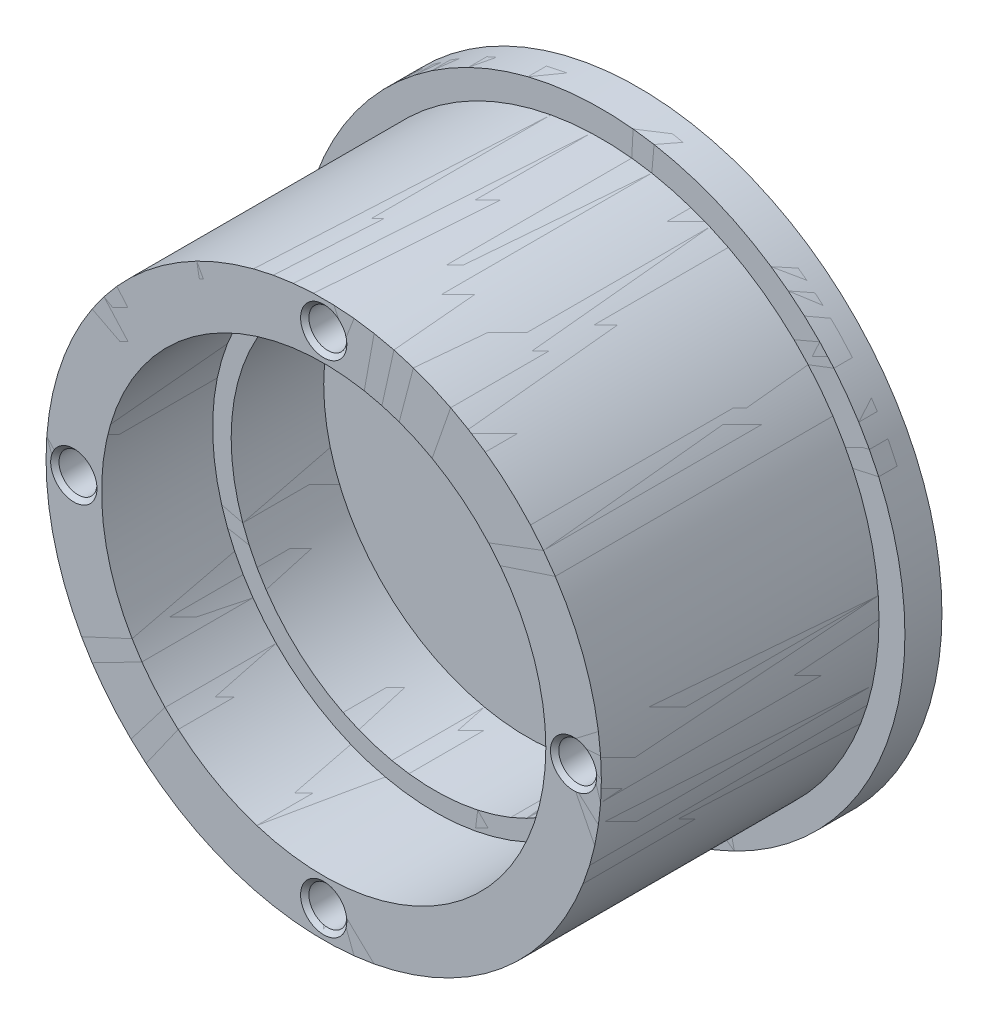
ISO-10303-21;
HEADER;
FILE_DESCRIPTION(('STEP AP214'),'2;1');
FILE_NAME('part.step','',(''),(''),'','','');
FILE_SCHEMA(('AUTOMOTIVE_DESIGN { 1 0 10303 214 1 1 1 1 }'));
ENDSEC;
DATA;
#1=APPLICATION_CONTEXT('core data for automotive mechanical design processes');
#2=APPLICATION_PROTOCOL_DEFINITION('international standard','automotive_design',2000,#1);
#3=PRODUCT_CONTEXT('',#1,'mechanical');
#4=PRODUCT('Part','Part','',(#3));
#5=PRODUCT_RELATED_PRODUCT_CATEGORY('part','',(#4));
#6=PRODUCT_DEFINITION_FORMATION('','',#4);
#7=PRODUCT_DEFINITION_CONTEXT('part definition',#1,'design');
#8=PRODUCT_DEFINITION('design','',#6,#7);
#9=PRODUCT_DEFINITION_SHAPE('','',#8);
#10=(LENGTH_UNIT() NAMED_UNIT(*) SI_UNIT(.MILLI.,.METRE.));
#11=(NAMED_UNIT(*) PLANE_ANGLE_UNIT() SI_UNIT($,.RADIAN.));
#12=(NAMED_UNIT(*) SI_UNIT($,.STERADIAN.) SOLID_ANGLE_UNIT());
#13=UNCERTAINTY_MEASURE_WITH_UNIT(LENGTH_MEASURE(1.E-05),#10,'distance_accuracy_value','');
#14=(GEOMETRIC_REPRESENTATION_CONTEXT(3) GLOBAL_UNCERTAINTY_ASSIGNED_CONTEXT((#13)) GLOBAL_UNIT_ASSIGNED_CONTEXT((#10,
#11,#12)) REPRESENTATION_CONTEXT('',''));
#15=CARTESIAN_POINT('',(0.,0.,0.));
#16=DIRECTION('',(0.,0.,1.));
#17=DIRECTION('',(1.,0.,0.));
#18=AXIS2_PLACEMENT_3D('',#15,#16,#17);
#19=CARTESIAN_POINT('',(0.,0.,-8.5));
#20=DIRECTION('',(0.,0.,1.));
#21=DIRECTION('',(1.,0.,0.));
#22=AXIS2_PLACEMENT_3D('',#19,#20,#21);
#23=CYLINDRICAL_SURFACE('',#22,16.4);
#24=CARTESIAN_POINT('',(0.,0.,-6.5));
#25=DIRECTION('',(0.,0.,-1.));
#26=DIRECTION('',(1.,0.,0.));
#27=AXIS2_PLACEMENT_3D('',#24,#25,#26);
#28=CIRCLE('',#27,16.4);
#29=CARTESIAN_POINT('',(16.4,0.,-6.5));
#30=VERTEX_POINT('',#29);
#31=EDGE_CURVE('P0_E151',#30,#30,#28,.T.);
#32=ORIENTED_EDGE('',*,*,#31,.T.);
#33=EDGE_LOOP('',(#32));
#34=FACE_BOUND('',#33,.T.);
#35=CARTESIAN_POINT('',(0.,0.,-7.5));
#36=DIRECTION('',(0.,0.,-1.));
#37=DIRECTION('',(-1.,0.,0.));
#38=AXIS2_PLACEMENT_3D('',#35,#36,#37);
#39=CIRCLE('',#38,16.4);
#40=CARTESIAN_POINT('',(-16.4,0.,-7.5));
#41=VERTEX_POINT('',#40);
#42=EDGE_CURVE('P0_E181',#41,#41,#39,.T.);
#43=ORIENTED_EDGE('',*,*,#42,.F.);
#44=EDGE_LOOP('',(#43));
#45=FACE_BOUND('',#44,.T.);
#46=ADVANCED_FACE('P0_F47',(#34,#45),#23,.T.);
#47=CARTESIAN_POINT('',(0.,13.5,8.5));
#48=DIRECTION('',(0.,0.,1.));
#49=DIRECTION('',(1.,0.,0.));
#50=AXIS2_PLACEMENT_3D('',#47,#48,#49);
#51=CONICAL_SURFACE('',#50,1.25,0.785398162500002);
#52=CARTESIAN_POINT('',(0.,13.5,8.5));
#53=DIRECTION('',(0.,0.,-1.));
#54=DIRECTION('',(1.,0.,0.));
#55=AXIS2_PLACEMENT_3D('',#52,#53,#54);
#56=CIRCLE('',#55,1.25);
#57=CARTESIAN_POINT('',(1.25000000000005,13.5,8.5));
#58=VERTEX_POINT('',#57);
#59=EDGE_CURVE('P0_E51',#58,#58,#56,.T.);
#60=ORIENTED_EDGE('',*,*,#59,.F.);
#61=EDGE_LOOP('',(#60));
#62=FACE_BOUND('',#61,.T.);
#63=CARTESIAN_POINT('',(0.,13.5,8.275));
#64=DIRECTION('',(0.,0.,1.));
#65=DIRECTION('',(1.,0.,0.));
#66=AXIS2_PLACEMENT_3D('',#63,#64,#65);
#67=CIRCLE('',#66,1.025);
#68=CARTESIAN_POINT('',(1.02500000000005,13.5,8.275));
#69=VERTEX_POINT('',#68);
#70=EDGE_CURVE('P0_E58',#69,#69,#67,.T.);
#71=ORIENTED_EDGE('',*,*,#70,.F.);
#72=EDGE_LOOP('',(#71));
#73=FACE_BOUND('',#72,.T.);
#74=ADVANCED_FACE('P0_F222',(#62,#73),#51,.F.);
#75=CARTESIAN_POINT('',(0.,13.5,8.5));
#76=DIRECTION('',(0.,0.,-1.));
#77=DIRECTION('',(-1.,0.,0.));
#78=AXIS2_PLACEMENT_3D('',#75,#76,#77);
#79=CYLINDRICAL_SURFACE('',#78,1.025);
#80=CARTESIAN_POINT('',(0.,13.5,3.5));
#81=DIRECTION('',(0.,0.,1.));
#82=DIRECTION('',(-1.,0.,0.));
#83=AXIS2_PLACEMENT_3D('',#80,#81,#82);
#84=CIRCLE('',#83,1.025);
#85=CARTESIAN_POINT('',(-1.02499999999995,13.5,3.5));
#86=VERTEX_POINT('',#85);
#87=EDGE_CURVE('P0_E140',#86,#86,#84,.T.);
#88=ORIENTED_EDGE('',*,*,#87,.F.);
#89=EDGE_LOOP('',(#88));
#90=FACE_BOUND('',#89,.T.);
#91=ORIENTED_EDGE('',*,*,#70,.T.);
#92=EDGE_LOOP('',(#91));
#93=FACE_BOUND('',#92,.T.);
#94=ADVANCED_FACE('P0_F227',(#90,#93),#79,.F.);
#95=CARTESIAN_POINT('',(0.,13.5,3.5));
#96=DIRECTION('',(0.,0.,1.));
#97=DIRECTION('',(1.,0.,0.));
#98=AXIS2_PLACEMENT_3D('',#95,#96,#97);
#99=CONICAL_SURFACE('',#98,1.025,1.0297442575);
#100=CARTESIAN_POINT('',(0.,13.5,2.88411786549675));
#101=VERTEX_POINT('',#100);
#102=VERTEX_LOOP('',#101);
#103=FACE_BOUND('',#102,.T.);
#104=ORIENTED_EDGE('',*,*,#87,.T.);
#105=EDGE_LOOP('',(#104));
#106=FACE_BOUND('',#105,.T.);
#107=ADVANCED_FACE('P0_F347',(#103,#106),#99,.F.);
#108=CARTESIAN_POINT('',(13.5,0.,8.5));
#109=DIRECTION('',(0.,0.,1.));
#110=DIRECTION('',(1.,0.,0.));
#111=AXIS2_PLACEMENT_3D('',#108,#109,#110);
#112=CONICAL_SURFACE('',#111,1.25,0.7853981625);
#113=CARTESIAN_POINT('',(13.5,0.,8.5));
#114=DIRECTION('',(0.,0.,-1.));
#115=DIRECTION('',(1.,0.,0.));
#116=AXIS2_PLACEMENT_3D('',#113,#114,#115);
#117=CIRCLE('',#116,1.25);
#118=CARTESIAN_POINT('',(14.75,0.,8.5));
#119=VERTEX_POINT('',#118);
#120=EDGE_CURVE('P0_E190',#119,#119,#117,.T.);
#121=ORIENTED_EDGE('',*,*,#120,.F.);
#122=EDGE_LOOP('',(#121));
#123=FACE_BOUND('',#122,.T.);
#124=CARTESIAN_POINT('',(13.5,0.,8.275));
#125=DIRECTION('',(0.,0.,1.));
#126=DIRECTION('',(1.,0.,0.));
#127=AXIS2_PLACEMENT_3D('',#124,#125,#126);
#128=CIRCLE('',#127,1.025);
#129=CARTESIAN_POINT('',(14.525,0.,8.275));
#130=VERTEX_POINT('',#129);
#131=EDGE_CURVE('P0_E136',#130,#130,#128,.T.);
#132=ORIENTED_EDGE('',*,*,#131,.F.);
#133=EDGE_LOOP('',(#132));
#134=FACE_BOUND('',#133,.T.);
#135=ADVANCED_FACE('P0_F343',(#123,#134),#112,.F.);
#136=CARTESIAN_POINT('',(13.5,0.,8.5));
#137=DIRECTION('',(0.,0.,-1.));
#138=DIRECTION('',(-1.,0.,0.));
#139=AXIS2_PLACEMENT_3D('',#136,#137,#138);
#140=CYLINDRICAL_SURFACE('',#139,1.025);
#141=CARTESIAN_POINT('',(13.5,0.,3.5));
#142=DIRECTION('',(0.,0.,1.));
#143=DIRECTION('',(-1.,0.,0.));
#144=AXIS2_PLACEMENT_3D('',#141,#142,#143);
#145=CIRCLE('',#144,1.025);
#146=CARTESIAN_POINT('',(12.475,0.,3.5));
#147=VERTEX_POINT('',#146);
#148=EDGE_CURVE('P0_E141',#147,#147,#145,.T.);
#149=ORIENTED_EDGE('',*,*,#148,.F.);
#150=EDGE_LOOP('',(#149));
#151=FACE_BOUND('',#150,.T.);
#152=ORIENTED_EDGE('',*,*,#131,.T.);
#153=EDGE_LOOP('',(#152));
#154=FACE_BOUND('',#153,.T.);
#155=ADVANCED_FACE('P0_F137',(#151,#154),#140,.F.);
#156=CARTESIAN_POINT('',(13.5,0.,3.5));
#157=DIRECTION('',(0.,0.,1.));
#158=DIRECTION('',(1.,0.,0.));
#159=AXIS2_PLACEMENT_3D('',#156,#157,#158);
#160=CONICAL_SURFACE('',#159,1.025,1.0297442575);
#161=CARTESIAN_POINT('',(13.5,0.,2.88411786549675));
#162=VERTEX_POINT('',#161);
#163=VERTEX_LOOP('',#162);
#164=FACE_BOUND('',#163,.T.);
#165=ORIENTED_EDGE('',*,*,#148,.T.);
#166=EDGE_LOOP('',(#165));
#167=FACE_BOUND('',#166,.T.);
#168=ADVANCED_FACE('P0_F49',(#164,#167),#160,.F.);
#169=CARTESIAN_POINT('',(0.,-13.5,8.5));
#170=DIRECTION('',(0.,0.,1.));
#171=DIRECTION('',(1.,0.,0.));
#172=AXIS2_PLACEMENT_3D('',#169,#170,#171);
#173=CONICAL_SURFACE('',#172,1.25,0.785398162500002);
#174=CARTESIAN_POINT('',(0.,-13.5,8.5));
#175=DIRECTION('',(0.,0.,-1.));
#176=DIRECTION('',(1.,0.,0.));
#177=AXIS2_PLACEMENT_3D('',#174,#175,#176);
#178=CIRCLE('',#177,1.25);
#179=CARTESIAN_POINT('',(1.24999999999998,-13.5,8.5));
#180=VERTEX_POINT('',#179);
#181=EDGE_CURVE('P0_E169',#180,#180,#178,.T.);
#182=ORIENTED_EDGE('',*,*,#181,.F.);
#183=EDGE_LOOP('',(#182));
#184=FACE_BOUND('',#183,.T.);
#185=CARTESIAN_POINT('',(0.,-13.5,8.275));
#186=DIRECTION('',(0.,0.,1.));
#187=DIRECTION('',(1.,0.,0.));
#188=AXIS2_PLACEMENT_3D('',#185,#186,#187);
#189=CIRCLE('',#188,1.025);
#190=CARTESIAN_POINT('',(1.02499999999998,-13.5,8.275));
#191=VERTEX_POINT('',#190);
#192=EDGE_CURVE('P0_E147',#191,#191,#189,.T.);
#193=ORIENTED_EDGE('',*,*,#192,.F.);
#194=EDGE_LOOP('',(#193));
#195=FACE_BOUND('',#194,.T.);
#196=ADVANCED_FACE('P0_F248',(#184,#195),#173,.F.);
#197=CARTESIAN_POINT('',(0.,-13.5,8.5));
#198=DIRECTION('',(0.,0.,-1.));
#199=DIRECTION('',(-1.,0.,0.));
#200=AXIS2_PLACEMENT_3D('',#197,#198,#199);
#201=CYLINDRICAL_SURFACE('',#200,1.025);
#202=CARTESIAN_POINT('',(0.,-13.5,3.5));
#203=DIRECTION('',(0.,0.,1.));
#204=DIRECTION('',(-1.,0.,0.));
#205=AXIS2_PLACEMENT_3D('',#202,#203,#204);
#206=CIRCLE('',#205,1.025);
#207=CARTESIAN_POINT('',(-1.02500000000002,-13.5,3.5));
#208=VERTEX_POINT('',#207);
#209=EDGE_CURVE('P0_E183',#208,#208,#206,.T.);
#210=ORIENTED_EDGE('',*,*,#209,.F.);
#211=EDGE_LOOP('',(#210));
#212=FACE_BOUND('',#211,.T.);
#213=ORIENTED_EDGE('',*,*,#192,.T.);
#214=EDGE_LOOP('',(#213));
#215=FACE_BOUND('',#214,.T.);
#216=ADVANCED_FACE('P0_F250',(#212,#215),#201,.F.);
#217=CARTESIAN_POINT('',(0.,-13.5,3.5));
#218=DIRECTION('',(0.,0.,1.));
#219=DIRECTION('',(1.,0.,0.));
#220=AXIS2_PLACEMENT_3D('',#217,#218,#219);
#221=CONICAL_SURFACE('',#220,1.025,1.0297442575);
#222=CARTESIAN_POINT('',(0.,-13.5,2.88411786549675));
#223=VERTEX_POINT('',#222);
#224=VERTEX_LOOP('',#223);
#225=FACE_BOUND('',#224,.T.);
#226=ORIENTED_EDGE('',*,*,#209,.T.);
#227=EDGE_LOOP('',(#226));
#228=FACE_BOUND('',#227,.T.);
#229=ADVANCED_FACE('P0_F246',(#225,#228),#221,.F.);
#230=CARTESIAN_POINT('',(-13.5,0.,8.5));
#231=DIRECTION('',(0.,0.,1.));
#232=DIRECTION('',(1.,0.,0.));
#233=AXIS2_PLACEMENT_3D('',#230,#231,#232);
#234=CONICAL_SURFACE('',#233,1.25,0.7853981625);
#235=CARTESIAN_POINT('',(-13.5,0.,8.5));
#236=DIRECTION('',(0.,0.,-1.));
#237=DIRECTION('',(1.,0.,0.));
#238=AXIS2_PLACEMENT_3D('',#235,#236,#237);
#239=CIRCLE('',#238,1.25);
#240=CARTESIAN_POINT('',(-12.25,0.,8.5));
#241=VERTEX_POINT('',#240);
#242=EDGE_CURVE('P0_E163',#241,#241,#239,.T.);
#243=ORIENTED_EDGE('',*,*,#242,.F.);
#244=EDGE_LOOP('',(#243));
#245=FACE_BOUND('',#244,.T.);
#246=CARTESIAN_POINT('',(-13.5,0.,8.275));
#247=DIRECTION('',(0.,0.,1.));
#248=DIRECTION('',(1.,0.,0.));
#249=AXIS2_PLACEMENT_3D('',#246,#247,#248);
#250=CIRCLE('',#249,1.025);
#251=CARTESIAN_POINT('',(-12.475,0.,8.275));
#252=VERTEX_POINT('',#251);
#253=EDGE_CURVE('P0_E186',#252,#252,#250,.T.);
#254=ORIENTED_EDGE('',*,*,#253,.F.);
#255=EDGE_LOOP('',(#254));
#256=FACE_BOUND('',#255,.T.);
#257=ADVANCED_FACE('P0_F243',(#245,#256),#234,.F.);
#258=CARTESIAN_POINT('',(-13.5,0.,8.5));
#259=DIRECTION('',(0.,0.,-1.));
#260=DIRECTION('',(-1.,0.,0.));
#261=AXIS2_PLACEMENT_3D('',#258,#259,#260);
#262=CYLINDRICAL_SURFACE('',#261,1.025);
#263=CARTESIAN_POINT('',(-13.5,0.,3.5));
#264=DIRECTION('',(0.,0.,1.));
#265=DIRECTION('',(-1.,0.,0.));
#266=AXIS2_PLACEMENT_3D('',#263,#264,#265);
#267=CIRCLE('',#266,1.025);
#268=CARTESIAN_POINT('',(-14.525,0.,3.5));
#269=VERTEX_POINT('',#268);
#270=EDGE_CURVE('P0_E161',#269,#269,#267,.T.);
#271=ORIENTED_EDGE('',*,*,#270,.F.);
#272=EDGE_LOOP('',(#271));
#273=FACE_BOUND('',#272,.T.);
#274=ORIENTED_EDGE('',*,*,#253,.T.);
#275=EDGE_LOOP('',(#274));
#276=FACE_BOUND('',#275,.T.);
#277=ADVANCED_FACE('P0_F240',(#273,#276),#262,.F.);
#278=CARTESIAN_POINT('',(-13.5,0.,3.5));
#279=DIRECTION('',(0.,0.,1.));
#280=DIRECTION('',(1.,0.,0.));
#281=AXIS2_PLACEMENT_3D('',#278,#279,#280);
#282=CONICAL_SURFACE('',#281,1.025,1.0297442575);
#283=CARTESIAN_POINT('',(-13.5,0.,2.88411786549675));
#284=VERTEX_POINT('',#283);
#285=VERTEX_LOOP('',#284);
#286=FACE_BOUND('',#285,.T.);
#287=ORIENTED_EDGE('',*,*,#270,.T.);
#288=EDGE_LOOP('',(#287));
#289=FACE_BOUND('',#288,.T.);
#290=ADVANCED_FACE('P0_F233',(#286,#289),#282,.F.);
#291=CARTESIAN_POINT('',(0.,0.,2.5));
#292=DIRECTION('',(0.,0.,1.));
#293=DIRECTION('',(1.,0.,0.));
#294=AXIS2_PLACEMENT_3D('',#291,#292,#293);
#295=CYLINDRICAL_SURFACE('',#294,12.);
#296=CARTESIAN_POINT('',(0.,0.,8.5));
#297=DIRECTION('',(0.,0.,1.));
#298=DIRECTION('',(1.,0.,0.));
#299=AXIS2_PLACEMENT_3D('',#296,#297,#298);
#300=CIRCLE('',#299,12.);
#301=CARTESIAN_POINT('',(12.,0.,8.5));
#302=VERTEX_POINT('',#301);
#303=EDGE_CURVE('P0_E155',#302,#302,#300,.T.);
#304=ORIENTED_EDGE('',*,*,#303,.T.);
#305=EDGE_LOOP('',(#304));
#306=FACE_BOUND('',#305,.T.);
#307=CARTESIAN_POINT('',(0.,0.,2.5));
#308=DIRECTION('',(0.,0.,-1.));
#309=DIRECTION('',(1.,0.,0.));
#310=AXIS2_PLACEMENT_3D('',#307,#308,#309);
#311=CIRCLE('',#310,12.);
#312=CARTESIAN_POINT('',(12.,0.,2.5));
#313=VERTEX_POINT('',#312);
#314=EDGE_CURVE('P0_E154',#313,#313,#311,.T.);
#315=ORIENTED_EDGE('',*,*,#314,.T.);
#316=EDGE_LOOP('',(#315));
#317=FACE_BOUND('',#316,.T.);
#318=ADVANCED_FACE('P0_F216',(#306,#317),#295,.F.);
#319=CARTESIAN_POINT('',(0.,0.,2.5));
#320=DIRECTION('',(0.,0.,1.));
#321=DIRECTION('',(1.,0.,0.));
#322=AXIS2_PLACEMENT_3D('',#319,#320,#321);
#323=PLANE('',#322);
#324=CARTESIAN_POINT('',(0.,0.,2.5));
#325=DIRECTION('',(0.,0.,-1.));
#326=DIRECTION('',(1.,0.,0.));
#327=AXIS2_PLACEMENT_3D('',#324,#325,#326);
#328=CIRCLE('',#327,11.);
#329=CARTESIAN_POINT('',(11.,0.,2.5));
#330=VERTEX_POINT('',#329);
#331=EDGE_CURVE('P0_E179',#330,#330,#328,.T.);
#332=ORIENTED_EDGE('',*,*,#331,.T.);
#333=EDGE_LOOP('',(#332));
#334=FACE_BOUND('',#333,.T.);
#335=ORIENTED_EDGE('',*,*,#314,.F.);
#336=EDGE_LOOP('',(#335));
#337=FACE_BOUND('',#336,.T.);
#338=ADVANCED_FACE('P0_F208',(#334,#337),#323,.T.);
#339=CARTESIAN_POINT('',(0.,0.,-6.5));
#340=DIRECTION('',(0.,0.,-1.));
#341=DIRECTION('',(0.,-1.,0.));
#342=AXIS2_PLACEMENT_3D('',#339,#340,#341);
#343=PLANE('',#342);
#344=ORIENTED_EDGE('',*,*,#31,.F.);
#345=EDGE_LOOP('',(#344));
#346=FACE_BOUND('',#345,.T.);
#347=CARTESIAN_POINT('',(0.,0.,-6.5));
#348=DIRECTION('',(0.,0.,1.));
#349=DIRECTION('',(1.,0.,0.));
#350=AXIS2_PLACEMENT_3D('',#347,#348,#349);
#351=CIRCLE('',#350,15.);
#352=CARTESIAN_POINT('',(15.,0.,-6.5));
#353=VERTEX_POINT('',#352);
#354=EDGE_CURVE('P0_E172',#353,#353,#351,.T.);
#355=ORIENTED_EDGE('',*,*,#354,.F.);
#356=EDGE_LOOP('',(#355));
#357=FACE_BOUND('',#356,.T.);
#358=ADVANCED_FACE('P0_F205',(#346,#357),#343,.F.);
#359=CARTESIAN_POINT('',(0.,0.,8.5));
#360=DIRECTION('',(0.,0.,1.));
#361=DIRECTION('',(1.,0.,0.));
#362=AXIS2_PLACEMENT_3D('',#359,#360,#361);
#363=PLANE('',#362);
#364=CARTESIAN_POINT('',(0.,0.,8.5));
#365=DIRECTION('',(0.,0.,1.));
#366=DIRECTION('',(1.,0.,0.));
#367=AXIS2_PLACEMENT_3D('',#364,#365,#366);
#368=CIRCLE('',#367,15.);
#369=CARTESIAN_POINT('',(15.,0.,8.5));
#370=VERTEX_POINT('',#369);
#371=EDGE_CURVE('P0_E191',#370,#370,#368,.T.);
#372=ORIENTED_EDGE('',*,*,#371,.T.);
#373=EDGE_LOOP('',(#372));
#374=FACE_BOUND('',#373,.T.);
#375=ORIENTED_EDGE('',*,*,#303,.F.);
#376=EDGE_LOOP('',(#375));
#377=FACE_BOUND('',#376,.T.);
#378=ORIENTED_EDGE('',*,*,#242,.T.);
#379=EDGE_LOOP('',(#378));
#380=FACE_BOUND('',#379,.T.);
#381=ORIENTED_EDGE('',*,*,#181,.T.);
#382=EDGE_LOOP('',(#381));
#383=FACE_BOUND('',#382,.T.);
#384=ORIENTED_EDGE('',*,*,#120,.T.);
#385=EDGE_LOOP('',(#384));
#386=FACE_BOUND('',#385,.T.);
#387=ORIENTED_EDGE('',*,*,#59,.T.);
#388=EDGE_LOOP('',(#387));
#389=FACE_BOUND('',#388,.T.);
#390=ADVANCED_FACE('P0_F207',(#374,#377,#380,#383,#386,#389),#363,.T.);
#391=CARTESIAN_POINT('',(0.,0.,-6.5));
#392=DIRECTION('',(0.,0.,1.));
#393=DIRECTION('',(1.,0.,0.));
#394=AXIS2_PLACEMENT_3D('',#391,#392,#393);
#395=CYLINDRICAL_SURFACE('',#394,15.);
#396=ORIENTED_EDGE('',*,*,#371,.F.);
#397=EDGE_LOOP('',(#396));
#398=FACE_BOUND('',#397,.T.);
#399=ORIENTED_EDGE('',*,*,#354,.T.);
#400=EDGE_LOOP('',(#399));
#401=FACE_BOUND('',#400,.T.);
#402=ADVANCED_FACE('P0_F203',(#398,#401),#395,.T.);
#403=CARTESIAN_POINT('',(0.,0.,-6.5));
#404=DIRECTION('',(0.,0.,1.));
#405=DIRECTION('',(1.,0.,0.));
#406=AXIS2_PLACEMENT_3D('',#403,#404,#405);
#407=CYLINDRICAL_SURFACE('',#406,11.);
#408=CARTESIAN_POINT('',(0.,0.,-2.5));
#409=DIRECTION('',(0.,0.,1.));
#410=DIRECTION('',(-1.,0.,0.));
#411=AXIS2_PLACEMENT_3D('',#408,#409,#410);
#412=CIRCLE('',#411,11.);
#413=CARTESIAN_POINT('',(-11.,0.,-2.5));
#414=VERTEX_POINT('',#413);
#415=EDGE_CURVE('P0_E175',#414,#414,#412,.T.);
#416=ORIENTED_EDGE('',*,*,#415,.F.);
#417=EDGE_LOOP('',(#416));
#418=FACE_BOUND('',#417,.T.);
#419=ORIENTED_EDGE('',*,*,#331,.F.);
#420=EDGE_LOOP('',(#419));
#421=FACE_BOUND('',#420,.T.);
#422=ADVANCED_FACE('P0_F235',(#418,#421),#407,.F.);
#423=CARTESIAN_POINT('',(0.,0.,-7.5));
#424=DIRECTION('',(0.,0.,-1.));
#425=DIRECTION('',(-1.,0.,0.));
#426=AXIS2_PLACEMENT_3D('',#423,#424,#425);
#427=PLANE('',#426);
#428=CARTESIAN_POINT('',(0.,0.,-7.5));
#429=DIRECTION('',(0.,0.,-1.));
#430=DIRECTION('',(-1.,0.,0.));
#431=AXIS2_PLACEMENT_3D('',#428,#429,#430);
#432=CIRCLE('',#431,6.);
#433=CARTESIAN_POINT('',(-6.,0.,-7.5));
#434=VERTEX_POINT('',#433);
#435=EDGE_CURVE('P0_E11',#434,#434,#432,.T.);
#436=ORIENTED_EDGE('',*,*,#435,.F.);
#437=EDGE_LOOP('',(#436));
#438=FACE_BOUND('',#437,.T.);
#439=ORIENTED_EDGE('',*,*,#42,.T.);
#440=EDGE_LOOP('',(#439));
#441=FACE_BOUND('',#440,.T.);
#442=ADVANCED_FACE('P0_F237',(#438,#441),#427,.T.);
#443=CARTESIAN_POINT('',(0.,0.,-2.5));
#444=DIRECTION('',(0.,0.,-1.));
#445=DIRECTION('',(-1.,0.,0.));
#446=AXIS2_PLACEMENT_3D('',#443,#444,#445);
#447=PLANE('',#446);
#448=ORIENTED_EDGE('',*,*,#415,.T.);
#449=EDGE_LOOP('',(#448));
#450=FACE_BOUND('',#449,.T.);
#451=ADVANCED_FACE('P0_F445',(#450),#447,.F.);
#452=CARTESIAN_POINT('',(0.,0.,-12.5));
#453=DIRECTION('',(0.,0.,1.));
#454=DIRECTION('',(1.,0.,0.));
#455=AXIS2_PLACEMENT_3D('',#452,#453,#454);
#456=CYLINDRICAL_SURFACE('',#455,6.);
#457=CARTESIAN_POINT('',(0.,0.,-12.5));
#458=DIRECTION('',(0.,0.,-1.));
#459=DIRECTION('',(-1.,0.,0.));
#460=AXIS2_PLACEMENT_3D('',#457,#458,#459);
#461=CIRCLE('',#460,6.);
#462=CARTESIAN_POINT('',(-6.,0.,-12.5));
#463=VERTEX_POINT('',#462);
#464=EDGE_CURVE('P0_E483',#463,#463,#461,.T.);
#465=ORIENTED_EDGE('',*,*,#464,.F.);
#466=EDGE_LOOP('',(#465));
#467=FACE_BOUND('',#466,.T.);
#468=ORIENTED_EDGE('',*,*,#435,.T.);
#469=EDGE_LOOP('',(#468));
#470=FACE_BOUND('',#469,.T.);
#471=ADVANCED_FACE('P0_F450',(#467,#470),#456,.T.);
#472=CARTESIAN_POINT('',(0.,0.,-12.5));
#473=DIRECTION('',(0.,0.,-1.));
#474=DIRECTION('',(-1.,0.,0.));
#475=AXIS2_PLACEMENT_3D('',#472,#473,#474);
#476=PLANE('',#475);
#477=ORIENTED_EDGE('',*,*,#464,.T.);
#478=EDGE_LOOP('',(#477));
#479=FACE_BOUND('',#478,.T.);
#480=ADVANCED_FACE('P0_F467',(#479),#476,.T.);
#481=CLOSED_SHELL('',(#46,#74,#94,#107,#135,#155,#168,#196,#216,#229,#257,#277,#290,#318,#338,
#358,#390,#402,#422,#442,#451,#471,#480));
#482=MANIFOLD_SOLID_BREP('P0_B2',#481);
#483=CARTESIAN_POINT('',(0.,13.5,8.5));
#484=DIRECTION('',(0.,0.,1.));
#485=DIRECTION('',(1.,0.,0.));
#486=AXIS2_PLACEMENT_3D('',#483,#484,#485);
#487=CONICAL_SURFACE('',#486,1.25,0.785398162500002);
#488=CARTESIAN_POINT('',(0.,13.5,8.5));
#489=DIRECTION('',(0.,0.,-1.));
#490=DIRECTION('',(1.,0.,0.));
#491=AXIS2_PLACEMENT_3D('',#488,#489,#490);
#492=CIRCLE('',#491,1.25);
#493=CARTESIAN_POINT('',(1.25000000000005,13.5,8.5));
#494=VERTEX_POINT('',#493);
#495=EDGE_CURVE('P1_E21',#494,#494,#492,.T.);
#496=ORIENTED_EDGE('',*,*,#495,.F.);
#497=EDGE_LOOP('',(#496));
#498=FACE_BOUND('',#497,.T.);
#499=CARTESIAN_POINT('',(0.,13.5,8.275));
#500=DIRECTION('',(0.,0.,1.));
#501=DIRECTION('',(1.,0.,0.));
#502=AXIS2_PLACEMENT_3D('',#499,#500,#501);
#503=CIRCLE('',#502,1.025);
#504=CARTESIAN_POINT('',(1.02500000000005,13.5,8.275));
#505=VERTEX_POINT('',#504);
#506=EDGE_CURVE('P1_E11',#505,#505,#503,.T.);
#507=ORIENTED_EDGE('',*,*,#506,.F.);
#508=EDGE_LOOP('',(#507));
#509=FACE_BOUND('',#508,.T.);
#510=ADVANCED_FACE('P1_F17',(#498,#509),#487,.F.);
#511=CARTESIAN_POINT('',(0.,13.5,8.5));
#512=DIRECTION('',(0.,0.,-1.));
#513=DIRECTION('',(-1.,0.,0.));
#514=AXIS2_PLACEMENT_3D('',#511,#512,#513);
#515=CYLINDRICAL_SURFACE('',#514,1.025);
#516=CARTESIAN_POINT('',(0.,13.5,3.5));
#517=DIRECTION('',(0.,0.,1.));
#518=DIRECTION('',(-1.,0.,0.));
#519=AXIS2_PLACEMENT_3D('',#516,#517,#518);
#520=CIRCLE('',#519,1.025);
#521=CARTESIAN_POINT('',(-1.02499999999995,13.5,3.5));
#522=VERTEX_POINT('',#521);
#523=EDGE_CURVE('P1_E28',#522,#522,#520,.T.);
#524=ORIENTED_EDGE('',*,*,#523,.F.);
#525=EDGE_LOOP('',(#524));
#526=FACE_BOUND('',#525,.T.);
#527=ORIENTED_EDGE('',*,*,#506,.T.);
#528=EDGE_LOOP('',(#527));
#529=FACE_BOUND('',#528,.T.);
#530=ADVANCED_FACE('P1_F213',(#526,#529),#515,.F.);
#531=CARTESIAN_POINT('',(0.,13.5,3.5));
#532=DIRECTION('',(0.,0.,1.));
#533=DIRECTION('',(1.,0.,0.));
#534=AXIS2_PLACEMENT_3D('',#531,#532,#533);
#535=CONICAL_SURFACE('',#534,1.025,1.0297442575);
#536=CARTESIAN_POINT('',(0.,13.5,2.88411786549675));
#537=VERTEX_POINT('',#536);
#538=VERTEX_LOOP('',#537);
#539=FACE_BOUND('',#538,.T.);
#540=ORIENTED_EDGE('',*,*,#523,.T.);
#541=EDGE_LOOP('',(#540));
#542=FACE_BOUND('',#541,.T.);
#543=ADVANCED_FACE('P1_F219',(#539,#542),#535,.F.);
#544=CARTESIAN_POINT('',(13.5,0.,8.5));
#545=DIRECTION('',(0.,0.,1.));
#546=DIRECTION('',(1.,0.,0.));
#547=AXIS2_PLACEMENT_3D('',#544,#545,#546);
#548=CONICAL_SURFACE('',#547,1.25,0.7853981625);
#549=CARTESIAN_POINT('',(13.5,0.,8.5));
#550=DIRECTION('',(0.,0.,-1.));
#551=DIRECTION('',(1.,0.,0.));
#552=AXIS2_PLACEMENT_3D('',#549,#550,#551);
#553=CIRCLE('',#552,1.25);
#554=CARTESIAN_POINT('',(14.75,0.,8.5));
#555=VERTEX_POINT('',#554);
#556=EDGE_CURVE('P1_E168',#555,#555,#553,.T.);
#557=ORIENTED_EDGE('',*,*,#556,.F.);
#558=EDGE_LOOP('',(#557));
#559=FACE_BOUND('',#558,.T.);
#560=CARTESIAN_POINT('',(13.5,0.,8.275));
#561=DIRECTION('',(0.,0.,1.));
#562=DIRECTION('',(1.,0.,0.));
#563=AXIS2_PLACEMENT_3D('',#560,#561,#562);
#564=CIRCLE('',#563,1.025);
#565=CARTESIAN_POINT('',(14.525,0.,8.275));
#566=VERTEX_POINT('',#565);
#567=EDGE_CURVE('P1_E122',#566,#566,#564,.T.);
#568=ORIENTED_EDGE('',*,*,#567,.F.);
#569=EDGE_LOOP('',(#568));
#570=FACE_BOUND('',#569,.T.);
#571=ADVANCED_FACE('P1_F224',(#559,#570),#548,.F.);
#572=CARTESIAN_POINT('',(13.5,0.,8.5));
#573=DIRECTION('',(0.,0.,-1.));
#574=DIRECTION('',(-1.,0.,0.));
#575=AXIS2_PLACEMENT_3D('',#572,#573,#574);
#576=CYLINDRICAL_SURFACE('',#575,1.025);
#577=CARTESIAN_POINT('',(13.5,0.,3.5));
#578=DIRECTION('',(0.,0.,1.));
#579=DIRECTION('',(-1.,0.,0.));
#580=AXIS2_PLACEMENT_3D('',#577,#578,#579);
#581=CIRCLE('',#580,1.025);
#582=CARTESIAN_POINT('',(12.475,0.,3.5));
#583=VERTEX_POINT('',#582);
#584=EDGE_CURVE('P1_E126',#583,#583,#581,.T.);
#585=ORIENTED_EDGE('',*,*,#584,.F.);
#586=EDGE_LOOP('',(#585));
#587=FACE_BOUND('',#586,.T.);
#588=ORIENTED_EDGE('',*,*,#567,.T.);
#589=EDGE_LOOP('',(#588));
#590=FACE_BOUND('',#589,.T.);
#591=ADVANCED_FACE('P1_F123',(#587,#590),#576,.F.);
#592=CARTESIAN_POINT('',(13.5,0.,3.5));
#593=DIRECTION('',(0.,0.,1.));
#594=DIRECTION('',(1.,0.,0.));
#595=AXIS2_PLACEMENT_3D('',#592,#593,#594);
#596=CONICAL_SURFACE('',#595,1.025,1.0297442575);
#597=CARTESIAN_POINT('',(13.5,0.,2.88411786549675));
#598=VERTEX_POINT('',#597);
#599=VERTEX_LOOP('',#598);
#600=FACE_BOUND('',#599,.T.);
#601=ORIENTED_EDGE('',*,*,#584,.T.);
#602=EDGE_LOOP('',(#601));
#603=FACE_BOUND('',#602,.T.);
#604=ADVANCED_FACE('P1_F19',(#600,#603),#596,.F.);
#605=CARTESIAN_POINT('',(0.,-13.5,8.5));
#606=DIRECTION('',(0.,0.,1.));
#607=DIRECTION('',(1.,0.,0.));
#608=AXIS2_PLACEMENT_3D('',#605,#606,#607);
#609=CONICAL_SURFACE('',#608,1.25,0.785398162500002);
#610=CARTESIAN_POINT('',(0.,-13.5,8.5));
#611=DIRECTION('',(0.,0.,-1.));
#612=DIRECTION('',(1.,0.,0.));
#613=AXIS2_PLACEMENT_3D('',#610,#611,#612);
#614=CIRCLE('',#613,1.25);
#615=CARTESIAN_POINT('',(1.24999999999998,-13.5,8.5));
#616=VERTEX_POINT('',#615);
#617=EDGE_CURVE('P1_E166',#616,#616,#614,.T.);
#618=ORIENTED_EDGE('',*,*,#617,.F.);
#619=EDGE_LOOP('',(#618));
#620=FACE_BOUND('',#619,.T.);
#621=CARTESIAN_POINT('',(0.,-13.5,8.275));
#622=DIRECTION('',(0.,0.,1.));
#623=DIRECTION('',(1.,0.,0.));
#624=AXIS2_PLACEMENT_3D('',#621,#622,#623);
#625=CIRCLE('',#624,1.025);
#626=CARTESIAN_POINT('',(1.02499999999998,-13.5,8.275));
#627=VERTEX_POINT('',#626);
#628=EDGE_CURVE('P1_E134',#627,#627,#625,.T.);
#629=ORIENTED_EDGE('',*,*,#628,.F.);
#630=EDGE_LOOP('',(#629));
#631=FACE_BOUND('',#630,.T.);
#632=ADVANCED_FACE('P1_F242',(#620,#631),#609,.F.);
#633=CARTESIAN_POINT('',(0.,-13.5,8.5));
#634=DIRECTION('',(0.,0.,-1.));
#635=DIRECTION('',(-1.,0.,0.));
#636=AXIS2_PLACEMENT_3D('',#633,#634,#635);
#637=CYLINDRICAL_SURFACE('',#636,1.025);
#638=CARTESIAN_POINT('',(0.,-13.5,3.5));
#639=DIRECTION('',(0.,0.,1.));
#640=DIRECTION('',(-1.,0.,0.));
#641=AXIS2_PLACEMENT_3D('',#638,#639,#640);
#642=CIRCLE('',#641,1.025);
#643=CARTESIAN_POINT('',(-1.02500000000002,-13.5,3.5));
#644=VERTEX_POINT('',#643);
#645=EDGE_CURVE('P1_E162',#644,#644,#642,.T.);
#646=ORIENTED_EDGE('',*,*,#645,.F.);
#647=EDGE_LOOP('',(#646));
#648=FACE_BOUND('',#647,.T.);
#649=ORIENTED_EDGE('',*,*,#628,.T.);
#650=EDGE_LOOP('',(#649));
#651=FACE_BOUND('',#650,.T.);
#652=ADVANCED_FACE('P1_F238',(#648,#651),#637,.F.);
#653=CARTESIAN_POINT('',(0.,-13.5,3.5));
#654=DIRECTION('',(0.,0.,1.));
#655=DIRECTION('',(1.,0.,0.));
#656=AXIS2_PLACEMENT_3D('',#653,#654,#655);
#657=CONICAL_SURFACE('',#656,1.025,1.0297442575);
#658=CARTESIAN_POINT('',(0.,-13.5,2.88411786549675));
#659=VERTEX_POINT('',#658);
#660=VERTEX_LOOP('',#659);
#661=FACE_BOUND('',#660,.T.);
#662=ORIENTED_EDGE('',*,*,#645,.T.);
#663=EDGE_LOOP('',(#662));
#664=FACE_BOUND('',#663,.T.);
#665=ADVANCED_FACE('P1_F241',(#661,#664),#657,.F.);
#666=CARTESIAN_POINT('',(-13.5,0.,8.5));
#667=DIRECTION('',(0.,0.,1.));
#668=DIRECTION('',(1.,0.,0.));
#669=AXIS2_PLACEMENT_3D('',#666,#667,#668);
#670=CONICAL_SURFACE('',#669,1.25,0.7853981625);
#671=CARTESIAN_POINT('',(-13.5,0.,8.5));
#672=DIRECTION('',(0.,0.,-1.));
#673=DIRECTION('',(1.,0.,0.));
#674=AXIS2_PLACEMENT_3D('',#671,#672,#673);
#675=CIRCLE('',#674,1.25);
#676=CARTESIAN_POINT('',(-12.25,0.,8.5));
#677=VERTEX_POINT('',#676);
#678=EDGE_CURVE('P1_E158',#677,#677,#675,.T.);
#679=ORIENTED_EDGE('',*,*,#678,.F.);
#680=EDGE_LOOP('',(#679));
#681=FACE_BOUND('',#680,.T.);
#682=CARTESIAN_POINT('',(-13.5,0.,8.275));
#683=DIRECTION('',(0.,0.,1.));
#684=DIRECTION('',(1.,0.,0.));
#685=AXIS2_PLACEMENT_3D('',#682,#683,#684);
#686=CIRCLE('',#685,1.025);
#687=CARTESIAN_POINT('',(-12.475,0.,8.275));
#688=VERTEX_POINT('',#687);
#689=EDGE_CURVE('P1_E163',#688,#688,#686,.T.);
#690=ORIENTED_EDGE('',*,*,#689,.F.);
#691=EDGE_LOOP('',(#690));
#692=FACE_BOUND('',#691,.T.);
#693=ADVANCED_FACE('P1_F323',(#681,#692),#670,.F.);
#694=CARTESIAN_POINT('',(-13.5,0.,8.5));
#695=DIRECTION('',(0.,0.,-1.));
#696=DIRECTION('',(-1.,0.,0.));
#697=AXIS2_PLACEMENT_3D('',#694,#695,#696);
#698=CYLINDRICAL_SURFACE('',#697,1.025);
#699=CARTESIAN_POINT('',(-13.5,0.,3.5));
#700=DIRECTION('',(0.,0.,1.));
#701=DIRECTION('',(-1.,0.,0.));
#702=AXIS2_PLACEMENT_3D('',#699,#700,#701);
#703=CIRCLE('',#702,1.025);
#704=CARTESIAN_POINT('',(-14.525,0.,3.5));
#705=VERTEX_POINT('',#704);
#706=EDGE_CURVE('P1_E165',#705,#705,#703,.T.);
#707=ORIENTED_EDGE('',*,*,#706,.F.);
#708=EDGE_LOOP('',(#707));
#709=FACE_BOUND('',#708,.T.);
#710=ORIENTED_EDGE('',*,*,#689,.T.);
#711=EDGE_LOOP('',(#710));
#712=FACE_BOUND('',#711,.T.);
#713=ADVANCED_FACE('P1_F331',(#709,#712),#698,.F.);
#714=CARTESIAN_POINT('',(-13.5,0.,3.5));
#715=DIRECTION('',(0.,0.,1.));
#716=DIRECTION('',(1.,0.,0.));
#717=AXIS2_PLACEMENT_3D('',#714,#715,#716);
#718=CONICAL_SURFACE('',#717,1.025,1.0297442575);
#719=CARTESIAN_POINT('',(-13.5,0.,2.88411786549675));
#720=VERTEX_POINT('',#719);
#721=VERTEX_LOOP('',#720);
#722=FACE_BOUND('',#721,.T.);
#723=ORIENTED_EDGE('',*,*,#706,.T.);
#724=EDGE_LOOP('',(#723));
#725=FACE_BOUND('',#724,.T.);
#726=ADVANCED_FACE('P1_F263',(#722,#725),#718,.F.);
#727=CARTESIAN_POINT('',(0.,0.,-2.5));
#728=DIRECTION('',(0.,0.,-1.));
#729=DIRECTION('',(-1.,0.,0.));
#730=AXIS2_PLACEMENT_3D('',#727,#728,#729);
#731=CYLINDRICAL_SURFACE('',#730,12.);
#732=CARTESIAN_POINT('',(0.,0.,-8.5));
#733=DIRECTION('',(0.,0.,-1.));
#734=DIRECTION('',(1.,0.,0.));
#735=AXIS2_PLACEMENT_3D('',#732,#733,#734);
#736=CIRCLE('',#735,12.);
#737=CARTESIAN_POINT('',(12.,0.,-8.5));
#738=VERTEX_POINT('',#737);
#739=EDGE_CURVE('P1_E140',#738,#738,#736,.T.);
#740=ORIENTED_EDGE('',*,*,#739,.T.);
#741=EDGE_LOOP('',(#740));
#742=FACE_BOUND('',#741,.T.);
#743=CARTESIAN_POINT('',(0.,0.,-2.5));
#744=DIRECTION('',(0.,0.,1.));
#745=DIRECTION('',(1.,0.,0.));
#746=AXIS2_PLACEMENT_3D('',#743,#744,#745);
#747=CIRCLE('',#746,12.);
#748=CARTESIAN_POINT('',(12.,0.,-2.5));
#749=VERTEX_POINT('',#748);
#750=EDGE_CURVE('P1_E266',#749,#749,#747,.T.);
#751=ORIENTED_EDGE('',*,*,#750,.T.);
#752=EDGE_LOOP('',(#751));
#753=FACE_BOUND('',#752,.T.);
#754=ADVANCED_FACE('P1_F260',(#742,#753),#731,.F.);
#755=CARTESIAN_POINT('',(0.,0.,-2.5));
#756=DIRECTION('',(0.,0.,-1.));
#757=DIRECTION('',(0.,-1.,0.));
#758=AXIS2_PLACEMENT_3D('',#755,#756,#757);
#759=PLANE('',#758);
#760=CARTESIAN_POINT('',(0.,0.,-2.5));
#761=DIRECTION('',(0.,0.,1.));
#762=DIRECTION('',(-1.,0.,0.));
#763=AXIS2_PLACEMENT_3D('',#760,#761,#762);
#764=CIRCLE('',#763,11.);
#765=CARTESIAN_POINT('',(-11.,0.,-2.5));
#766=VERTEX_POINT('',#765);
#767=EDGE_CURVE('P1_E178',#766,#766,#764,.T.);
#768=ORIENTED_EDGE('',*,*,#767,.T.);
#769=EDGE_LOOP('',(#768));
#770=FACE_BOUND('',#769,.T.);
#771=ORIENTED_EDGE('',*,*,#750,.F.);
#772=EDGE_LOOP('',(#771));
#773=FACE_BOUND('',#772,.T.);
#774=ADVANCED_FACE('P1_F233',(#770,#773),#759,.T.);
#775=CARTESIAN_POINT('',(0.,0.,2.5));
#776=DIRECTION('',(0.,0.,1.));
#777=DIRECTION('',(1.,0.,0.));
#778=AXIS2_PLACEMENT_3D('',#775,#776,#777);
#779=CYLINDRICAL_SURFACE('',#778,12.);
#780=CARTESIAN_POINT('',(0.,0.,8.5));
#781=DIRECTION('',(0.,0.,1.));
#782=DIRECTION('',(1.,0.,0.));
#783=AXIS2_PLACEMENT_3D('',#780,#781,#782);
#784=CIRCLE('',#783,12.);
#785=CARTESIAN_POINT('',(12.,0.,8.5));
#786=VERTEX_POINT('',#785);
#787=EDGE_CURVE('P1_E150',#786,#786,#784,.T.);
#788=ORIENTED_EDGE('',*,*,#787,.T.);
#789=EDGE_LOOP('',(#788));
#790=FACE_BOUND('',#789,.T.);
#791=CARTESIAN_POINT('',(0.,0.,2.5));
#792=DIRECTION('',(0.,0.,-1.));
#793=DIRECTION('',(1.,0.,0.));
#794=AXIS2_PLACEMENT_3D('',#791,#792,#793);
#795=CIRCLE('',#794,12.);
#796=CARTESIAN_POINT('',(12.,0.,2.5));
#797=VERTEX_POINT('',#796);
#798=EDGE_CURVE('P1_E147',#797,#797,#795,.T.);
#799=ORIENTED_EDGE('',*,*,#798,.T.);
#800=EDGE_LOOP('',(#799));
#801=FACE_BOUND('',#800,.T.);
#802=ADVANCED_FACE('P1_F230',(#790,#801),#779,.F.);
#803=CARTESIAN_POINT('',(0.,0.,2.5));
#804=DIRECTION('',(0.,0.,1.));
#805=DIRECTION('',(1.,0.,0.));
#806=AXIS2_PLACEMENT_3D('',#803,#804,#805);
#807=PLANE('',#806);
#808=CARTESIAN_POINT('',(0.,0.,2.5));
#809=DIRECTION('',(0.,0.,-1.));
#810=DIRECTION('',(1.,0.,0.));
#811=AXIS2_PLACEMENT_3D('',#808,#809,#810);
#812=CIRCLE('',#811,11.);
#813=CARTESIAN_POINT('',(11.,0.,2.5));
#814=VERTEX_POINT('',#813);
#815=EDGE_CURVE('P1_E184',#814,#814,#812,.T.);
#816=ORIENTED_EDGE('',*,*,#815,.T.);
#817=EDGE_LOOP('',(#816));
#818=FACE_BOUND('',#817,.T.);
#819=ORIENTED_EDGE('',*,*,#798,.F.);
#820=EDGE_LOOP('',(#819));
#821=FACE_BOUND('',#820,.T.);
#822=ADVANCED_FACE('P1_F194',(#818,#821),#807,.T.);
#823=CARTESIAN_POINT('',(0.,0.,-6.5));
#824=DIRECTION('',(0.,0.,-1.));
#825=DIRECTION('',(0.,-1.,0.));
#826=AXIS2_PLACEMENT_3D('',#823,#824,#825);
#827=PLANE('',#826);
#828=CARTESIAN_POINT('',(0.,0.,-6.5));
#829=DIRECTION('',(0.,0.,-1.));
#830=DIRECTION('',(1.,0.,0.));
#831=AXIS2_PLACEMENT_3D('',#828,#829,#830);
#832=CIRCLE('',#831,16.4);
#833=CARTESIAN_POINT('',(16.4,0.,-6.5));
#834=VERTEX_POINT('',#833);
#835=EDGE_CURVE('P1_E138',#834,#834,#832,.T.);
#836=ORIENTED_EDGE('',*,*,#835,.F.);
#837=EDGE_LOOP('',(#836));
#838=FACE_BOUND('',#837,.T.);
#839=CARTESIAN_POINT('',(0.,0.,-6.5));
#840=DIRECTION('',(0.,0.,1.));
#841=DIRECTION('',(1.,0.,0.));
#842=AXIS2_PLACEMENT_3D('',#839,#840,#841);
#843=CIRCLE('',#842,15.);
#844=CARTESIAN_POINT('',(15.,0.,-6.5));
#845=VERTEX_POINT('',#844);
#846=EDGE_CURVE('P1_E172',#845,#845,#843,.T.);
#847=ORIENTED_EDGE('',*,*,#846,.F.);
#848=EDGE_LOOP('',(#847));
#849=FACE_BOUND('',#848,.T.);
#850=ADVANCED_FACE('P1_F246',(#838,#849),#827,.F.);
#851=CARTESIAN_POINT('',(0.,0.,-8.5));
#852=DIRECTION('',(0.,0.,-1.));
#853=DIRECTION('',(0.,-1.,0.));
#854=AXIS2_PLACEMENT_3D('',#851,#852,#853);
#855=PLANE('',#854);
#856=CARTESIAN_POINT('',(0.,0.,-8.5));
#857=DIRECTION('',(0.,0.,-1.));
#858=DIRECTION('',(1.,0.,0.));
#859=AXIS2_PLACEMENT_3D('',#856,#857,#858);
#860=CIRCLE('',#859,16.4);
#861=CARTESIAN_POINT('',(16.4,0.,-8.5));
#862=VERTEX_POINT('',#861);
#863=EDGE_CURVE('P1_E141',#862,#862,#860,.T.);
#864=ORIENTED_EDGE('',*,*,#863,.T.);
#865=EDGE_LOOP('',(#864));
#866=FACE_BOUND('',#865,.T.);
#867=ORIENTED_EDGE('',*,*,#739,.F.);
#868=EDGE_LOOP('',(#867));
#869=FACE_BOUND('',#868,.T.);
#870=ADVANCED_FACE('P1_F247',(#866,#869),#855,.T.);
#871=CARTESIAN_POINT('',(0.,0.,-8.5));
#872=DIRECTION('',(0.,0.,1.));
#873=DIRECTION('',(1.,0.,0.));
#874=AXIS2_PLACEMENT_3D('',#871,#872,#873);
#875=CYLINDRICAL_SURFACE('',#874,16.4);
#876=ORIENTED_EDGE('',*,*,#835,.T.);
#877=EDGE_LOOP('',(#876));
#878=FACE_BOUND('',#877,.T.);
#879=ORIENTED_EDGE('',*,*,#863,.F.);
#880=EDGE_LOOP('',(#879));
#881=FACE_BOUND('',#880,.T.);
#882=ADVANCED_FACE('P1_F249',(#878,#881),#875,.T.);
#883=CARTESIAN_POINT('',(0.,0.,8.5));
#884=DIRECTION('',(0.,0.,1.));
#885=DIRECTION('',(1.,0.,0.));
#886=AXIS2_PLACEMENT_3D('',#883,#884,#885);
#887=PLANE('',#886);
#888=CARTESIAN_POINT('',(0.,0.,8.5));
#889=DIRECTION('',(0.,0.,1.));
#890=DIRECTION('',(1.,0.,0.));
#891=AXIS2_PLACEMENT_3D('',#888,#889,#890);
#892=CIRCLE('',#891,15.);
#893=CARTESIAN_POINT('',(15.,0.,8.5));
#894=VERTEX_POINT('',#893);
#895=EDGE_CURVE('P1_E169',#894,#894,#892,.T.);
#896=ORIENTED_EDGE('',*,*,#895,.T.);
#897=EDGE_LOOP('',(#896));
#898=FACE_BOUND('',#897,.T.);
#899=ORIENTED_EDGE('',*,*,#787,.F.);
#900=EDGE_LOOP('',(#899));
#901=FACE_BOUND('',#900,.T.);
#902=ORIENTED_EDGE('',*,*,#678,.T.);
#903=EDGE_LOOP('',(#902));
#904=FACE_BOUND('',#903,.T.);
#905=ORIENTED_EDGE('',*,*,#617,.T.);
#906=EDGE_LOOP('',(#905));
#907=FACE_BOUND('',#906,.T.);
#908=ORIENTED_EDGE('',*,*,#556,.T.);
#909=EDGE_LOOP('',(#908));
#910=FACE_BOUND('',#909,.T.);
#911=ORIENTED_EDGE('',*,*,#495,.T.);
#912=EDGE_LOOP('',(#911));
#913=FACE_BOUND('',#912,.T.);
#914=ADVANCED_FACE('P1_F206',(#898,#901,#904,#907,#910,#913),#887,.T.);
#915=CARTESIAN_POINT('',(0.,0.,-6.5));
#916=DIRECTION('',(0.,0.,1.));
#917=DIRECTION('',(1.,0.,0.));
#918=AXIS2_PLACEMENT_3D('',#915,#916,#917);
#919=CYLINDRICAL_SURFACE('',#918,15.);
#920=ORIENTED_EDGE('',*,*,#895,.F.);
#921=EDGE_LOOP('',(#920));
#922=FACE_BOUND('',#921,.T.);
#923=ORIENTED_EDGE('',*,*,#846,.T.);
#924=EDGE_LOOP('',(#923));
#925=FACE_BOUND('',#924,.T.);
#926=ADVANCED_FACE('P1_F199',(#922,#925),#919,.T.);
#927=CARTESIAN_POINT('',(0.,0.,-6.5));
#928=DIRECTION('',(0.,0.,1.));
#929=DIRECTION('',(1.,0.,0.));
#930=AXIS2_PLACEMENT_3D('',#927,#928,#929);
#931=CYLINDRICAL_SURFACE('',#930,11.);
#932=ORIENTED_EDGE('',*,*,#767,.F.);
#933=EDGE_LOOP('',(#932));
#934=FACE_BOUND('',#933,.T.);
#935=ORIENTED_EDGE('',*,*,#815,.F.);
#936=EDGE_LOOP('',(#935));
#937=FACE_BOUND('',#936,.T.);
#938=ADVANCED_FACE('P1_F197',(#934,#937),#931,.F.);
#939=CLOSED_SHELL('',(#510,#530,#543,#571,#591,#604,#632,#652,#665,#693,#713,#726,#754,#774,
#802,#822,#850,#870,#882,#914,#926,#938));
#940=MANIFOLD_SOLID_BREP('P1_B1',#939);
#941=ADVANCED_BREP_SHAPE_REPRESENTATION('',(#18,#482,#940),#14);
#942=SHAPE_DEFINITION_REPRESENTATION(#9,#941);
ENDSEC;
END-ISO-10303-21;
